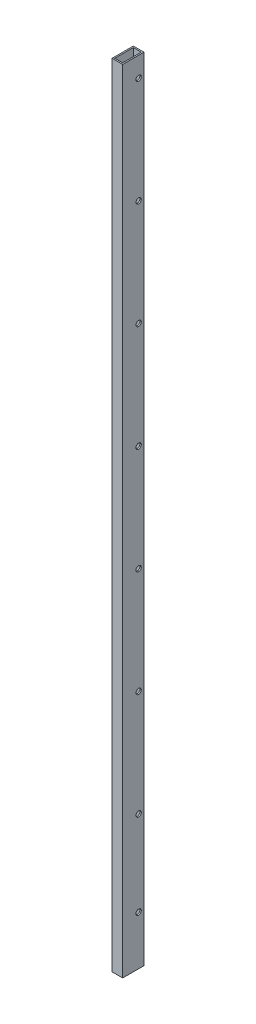
ISO-10303-21;
HEADER;
FILE_DESCRIPTION(('STEP AP214'),'2;1');
FILE_NAME('part.step','',(''),(''),'','','');
FILE_SCHEMA(('AUTOMOTIVE_DESIGN { 1 0 10303 214 1 1 1 1 }'));
ENDSEC;
DATA;
#1=APPLICATION_CONTEXT('core data for automotive mechanical design processes');
#2=APPLICATION_PROTOCOL_DEFINITION('international standard','automotive_design',2000,#1);
#3=PRODUCT_CONTEXT('',#1,'mechanical');
#4=PRODUCT('Part','Part','',(#3));
#5=PRODUCT_RELATED_PRODUCT_CATEGORY('part','',(#4));
#6=PRODUCT_DEFINITION_FORMATION('','',#4);
#7=PRODUCT_DEFINITION_CONTEXT('part definition',#1,'design');
#8=PRODUCT_DEFINITION('design','',#6,#7);
#9=PRODUCT_DEFINITION_SHAPE('','',#8);
#10=(LENGTH_UNIT() NAMED_UNIT(*) SI_UNIT(.MILLI.,.METRE.));
#11=(NAMED_UNIT(*) PLANE_ANGLE_UNIT() SI_UNIT($,.RADIAN.));
#12=(NAMED_UNIT(*) SI_UNIT($,.STERADIAN.) SOLID_ANGLE_UNIT());
#13=UNCERTAINTY_MEASURE_WITH_UNIT(LENGTH_MEASURE(1.E-05),#10,'distance_accuracy_value','');
#14=(GEOMETRIC_REPRESENTATION_CONTEXT(3) GLOBAL_UNCERTAINTY_ASSIGNED_CONTEXT((#13)) GLOBAL_UNIT_ASSIGNED_CONTEXT((#10,
#11,#12)) REPRESENTATION_CONTEXT('',''));
#15=CARTESIAN_POINT('',(0.,0.,0.));
#16=DIRECTION('',(0.,0.,1.));
#17=DIRECTION('',(1.,0.,0.));
#18=AXIS2_PLACEMENT_3D('',#15,#16,#17);
#19=CARTESIAN_POINT('',(0.,1892.3,0.));
#20=DIRECTION('',(0.,1.,0.));
#21=DIRECTION('',(0.,0.,1.));
#22=AXIS2_PLACEMENT_3D('',#19,#20,#21);
#23=PLANE('',#22);
#24=DIRECTION('',(0.,0.,-1.));
#25=VECTOR('',#24,1.);
#26=CARTESIAN_POINT('',(12.7,1892.3,-25.4));
#27=LINE('',#26,#25);
#28=CARTESIAN_POINT('',(12.7,1892.3,25.4));
#29=VERTEX_POINT('',#28);
#30=CARTESIAN_POINT('',(12.7,1892.3,-25.4));
#31=VERTEX_POINT('',#30);
#32=EDGE_CURVE('E138',#29,#31,#27,.T.);
#33=ORIENTED_EDGE('',*,*,#32,.T.);
#34=DIRECTION('',(-1.,0.,0.));
#35=VECTOR('',#34,1.);
#36=CARTESIAN_POINT('',(-12.7,1892.3,-25.4));
#37=LINE('',#36,#35);
#38=CARTESIAN_POINT('',(-12.7,1892.3,-25.4));
#39=VERTEX_POINT('',#38);
#40=EDGE_CURVE('E141',#31,#39,#37,.T.);
#41=ORIENTED_EDGE('',*,*,#40,.T.);
#42=DIRECTION('',(0.,0.,1.));
#43=VECTOR('',#42,1.);
#44=CARTESIAN_POINT('',(-12.7,1892.3,-25.4));
#45=LINE('',#44,#43);
#46=CARTESIAN_POINT('',(-12.7,1892.3,25.4));
#47=VERTEX_POINT('',#46);
#48=EDGE_CURVE('E144',#39,#47,#45,.T.);
#49=ORIENTED_EDGE('',*,*,#48,.T.);
#50=DIRECTION('',(1.,0.,0.));
#51=VECTOR('',#50,1.);
#52=CARTESIAN_POINT('',(-12.7,1892.3,25.4));
#53=LINE('',#52,#51);
#54=EDGE_CURVE('E146',#47,#29,#53,.T.);
#55=ORIENTED_EDGE('',*,*,#54,.T.);
#56=EDGE_LOOP('',(#33,#41,#49,#55));
#57=FACE_BOUND('',#56,.T.);
#58=DIRECTION('',(1.,0.,0.));
#59=VECTOR('',#58,1.);
#60=CARTESIAN_POINT('',(-9.525,1892.3,22.225));
#61=LINE('',#60,#59);
#62=CARTESIAN_POINT('',(-9.525,1892.3,22.225));
#63=VERTEX_POINT('',#62);
#64=CARTESIAN_POINT('',(9.525,1892.3,22.225));
#65=VERTEX_POINT('',#64);
#66=EDGE_CURVE('E108',#63,#65,#61,.T.);
#67=ORIENTED_EDGE('',*,*,#66,.F.);
#68=DIRECTION('',(0.,0.,1.));
#69=VECTOR('',#68,1.);
#70=CARTESIAN_POINT('',(-9.52500000000001,1892.3,-22.225));
#71=LINE('',#70,#69);
#72=CARTESIAN_POINT('',(-9.52500000000001,1892.3,-22.225));
#73=VERTEX_POINT('',#72);
#74=EDGE_CURVE('E100',#73,#63,#71,.T.);
#75=ORIENTED_EDGE('',*,*,#74,.F.);
#76=DIRECTION('',(-1.,0.,0.));
#77=VECTOR('',#76,1.);
#78=CARTESIAN_POINT('',(-9.52500000000001,1892.3,-22.225));
#79=LINE('',#78,#77);
#80=CARTESIAN_POINT('',(9.525,1892.3,-22.225));
#81=VERTEX_POINT('',#80);
#82=EDGE_CURVE('E122',#81,#73,#79,.T.);
#83=ORIENTED_EDGE('',*,*,#82,.F.);
#84=DIRECTION('',(0.,0.,-1.));
#85=VECTOR('',#84,1.);
#86=CARTESIAN_POINT('',(9.525,1892.3,-22.225));
#87=LINE('',#86,#85);
#88=EDGE_CURVE('E120',#65,#81,#87,.T.);
#89=ORIENTED_EDGE('',*,*,#88,.F.);
#90=EDGE_LOOP('',(#67,#75,#83,#89));
#91=FACE_BOUND('',#90,.T.);
#92=ADVANCED_FACE('F35',(#57,#91),#23,.T.);
#93=CARTESIAN_POINT('',(0.,0.,0.));
#94=DIRECTION('',(0.,1.,0.));
#95=DIRECTION('',(0.,0.,1.));
#96=AXIS2_PLACEMENT_3D('',#93,#94,#95);
#97=PLANE('',#96);
#98=DIRECTION('',(0.,0.,-1.));
#99=VECTOR('',#98,1.);
#100=CARTESIAN_POINT('',(12.7,0.,-25.4));
#101=LINE('',#100,#99);
#102=CARTESIAN_POINT('',(12.7,0.,25.4));
#103=VERTEX_POINT('',#102);
#104=CARTESIAN_POINT('',(12.7,0.,-25.4));
#105=VERTEX_POINT('',#104);
#106=EDGE_CURVE('E116',#103,#105,#101,.T.);
#107=ORIENTED_EDGE('',*,*,#106,.F.);
#108=DIRECTION('',(1.,0.,0.));
#109=VECTOR('',#108,1.);
#110=CARTESIAN_POINT('',(-12.7,0.,25.4));
#111=LINE('',#110,#109);
#112=CARTESIAN_POINT('',(-12.7,0.,25.4));
#113=VERTEX_POINT('',#112);
#114=EDGE_CURVE('E142',#113,#103,#111,.T.);
#115=ORIENTED_EDGE('',*,*,#114,.F.);
#116=DIRECTION('',(0.,0.,1.));
#117=VECTOR('',#116,1.);
#118=CARTESIAN_POINT('',(-12.7,0.,-25.4));
#119=LINE('',#118,#117);
#120=CARTESIAN_POINT('',(-12.7,0.,-25.4));
#121=VERTEX_POINT('',#120);
#122=EDGE_CURVE('E153',#121,#113,#119,.T.);
#123=ORIENTED_EDGE('',*,*,#122,.F.);
#124=DIRECTION('',(-1.,0.,0.));
#125=VECTOR('',#124,1.);
#126=CARTESIAN_POINT('',(-12.7,0.,-25.4));
#127=LINE('',#126,#125);
#128=EDGE_CURVE('E151',#105,#121,#127,.T.);
#129=ORIENTED_EDGE('',*,*,#128,.F.);
#130=EDGE_LOOP('',(#107,#115,#123,#129));
#131=FACE_BOUND('',#130,.T.);
#132=DIRECTION('',(0.,0.,1.));
#133=VECTOR('',#132,1.);
#134=CARTESIAN_POINT('',(-9.52500000000001,0.,-22.225));
#135=LINE('',#134,#133);
#136=CARTESIAN_POINT('',(-9.52500000000001,0.,-22.225));
#137=VERTEX_POINT('',#136);
#138=CARTESIAN_POINT('',(-9.525,0.,22.225));
#139=VERTEX_POINT('',#138);
#140=EDGE_CURVE('E58',#137,#139,#135,.T.);
#141=ORIENTED_EDGE('',*,*,#140,.T.);
#142=DIRECTION('',(1.,0.,0.));
#143=VECTOR('',#142,1.);
#144=CARTESIAN_POINT('',(-9.525,0.,22.225));
#145=LINE('',#144,#143);
#146=CARTESIAN_POINT('',(9.525,0.,22.225));
#147=VERTEX_POINT('',#146);
#148=EDGE_CURVE('E115',#139,#147,#145,.T.);
#149=ORIENTED_EDGE('',*,*,#148,.T.);
#150=DIRECTION('',(0.,0.,-1.));
#151=VECTOR('',#150,1.);
#152=CARTESIAN_POINT('',(9.525,0.,-22.225));
#153=LINE('',#152,#151);
#154=CARTESIAN_POINT('',(9.525,0.,-22.225));
#155=VERTEX_POINT('',#154);
#156=EDGE_CURVE('E130',#147,#155,#153,.T.);
#157=ORIENTED_EDGE('',*,*,#156,.T.);
#158=DIRECTION('',(-1.,0.,0.));
#159=VECTOR('',#158,1.);
#160=CARTESIAN_POINT('',(-9.52500000000001,0.,-22.225));
#161=LINE('',#160,#159);
#162=EDGE_CURVE('E109',#155,#137,#161,.T.);
#163=ORIENTED_EDGE('',*,*,#162,.T.);
#164=EDGE_LOOP('',(#141,#149,#157,#163));
#165=FACE_BOUND('',#164,.T.);
#166=ADVANCED_FACE('F171',(#131,#165),#97,.F.);
#167=CARTESIAN_POINT('',(12.7,1892.3,-25.4));
#168=DIRECTION('',(-1.,0.,0.));
#169=DIRECTION('',(0.,0.,1.));
#170=AXIS2_PLACEMENT_3D('',#167,#168,#169);
#171=PLANE('',#170);
#172=CARTESIAN_POINT('',(12.7,117.458598875323,-12.7000000000245));
#173=DIRECTION('',(1.,0.,0.));
#174=DIRECTION('',(0.,0.,-1.));
#175=AXIS2_PLACEMENT_3D('',#172,#173,#174);
#176=CIRCLE('',#175,6.35000000001205);
#177=CARTESIAN_POINT('',(12.7,117.458598875323,-19.0500000000365));
#178=VERTEX_POINT('',#177);
#179=EDGE_CURVE('E317',#178,#178,#176,.T.);
#180=ORIENTED_EDGE('',*,*,#179,.F.);
#181=EDGE_LOOP('',(#180));
#182=FACE_BOUND('',#181,.T.);
#183=CARTESIAN_POINT('',(12.7,320.658598875324,-12.6999999989671));
#184=DIRECTION('',(1.,0.,0.));
#185=DIRECTION('',(0.,0.,-1.));
#186=AXIS2_PLACEMENT_3D('',#183,#184,#185);
#187=CIRCLE('',#186,6.34999999999999);
#188=CARTESIAN_POINT('',(12.7,320.658598875324,-19.049999998967));
#189=VERTEX_POINT('',#188);
#190=EDGE_CURVE('E311',#189,#189,#187,.T.);
#191=ORIENTED_EDGE('',*,*,#190,.F.);
#192=EDGE_LOOP('',(#191));
#193=FACE_BOUND('',#192,.T.);
#194=CARTESIAN_POINT('',(12.7,574.658598875324,-12.6999999991433));
#195=DIRECTION('',(1.,0.,0.));
#196=DIRECTION('',(0.,0.,-1.));
#197=AXIS2_PLACEMENT_3D('',#194,#195,#196);
#198=CIRCLE('',#197,6.34999999999999);
#199=CARTESIAN_POINT('',(12.7,574.658598875324,-19.0499999991433));
#200=VERTEX_POINT('',#199);
#201=EDGE_CURVE('E305',#200,#200,#198,.T.);
#202=ORIENTED_EDGE('',*,*,#201,.F.);
#203=EDGE_LOOP('',(#202));
#204=FACE_BOUND('',#203,.T.);
#205=CARTESIAN_POINT('',(12.7,828.658598875324,-12.6999999993195));
#206=DIRECTION('',(1.,0.,0.));
#207=DIRECTION('',(0.,0.,-1.));
#208=AXIS2_PLACEMENT_3D('',#205,#206,#207);
#209=CIRCLE('',#208,6.34999999999998);
#210=CARTESIAN_POINT('',(12.7,828.658598875324,-19.0499999993195));
#211=VERTEX_POINT('',#210);
#212=EDGE_CURVE('E299',#211,#211,#209,.T.);
#213=ORIENTED_EDGE('',*,*,#212,.F.);
#214=EDGE_LOOP('',(#213));
#215=FACE_BOUND('',#214,.T.);
#216=CARTESIAN_POINT('',(12.7,1082.65859887532,-12.6999999994958));
#217=DIRECTION('',(1.,0.,0.));
#218=DIRECTION('',(0.,0.,-1.));
#219=AXIS2_PLACEMENT_3D('',#216,#217,#218);
#220=CIRCLE('',#219,6.34999999999999);
#221=CARTESIAN_POINT('',(12.7,1082.65859887532,-19.0499999994957));
#222=VERTEX_POINT('',#221);
#223=EDGE_CURVE('E293',#222,#222,#220,.T.);
#224=ORIENTED_EDGE('',*,*,#223,.F.);
#225=EDGE_LOOP('',(#224));
#226=FACE_BOUND('',#225,.T.);
#227=CARTESIAN_POINT('',(12.7,1336.65859887532,-12.699999999672));
#228=DIRECTION('',(1.,0.,0.));
#229=DIRECTION('',(0.,0.,-1.));
#230=AXIS2_PLACEMENT_3D('',#227,#228,#229);
#231=CIRCLE('',#230,6.34999999999999);
#232=CARTESIAN_POINT('',(12.7,1336.65859887532,-19.049999999672));
#233=VERTEX_POINT('',#232);
#234=EDGE_CURVE('E287',#233,#233,#231,.T.);
#235=ORIENTED_EDGE('',*,*,#234,.F.);
#236=EDGE_LOOP('',(#235));
#237=FACE_BOUND('',#236,.T.);
#238=CARTESIAN_POINT('',(12.7,1590.65859887532,-12.6999999998482));
#239=DIRECTION('',(1.,0.,0.));
#240=DIRECTION('',(0.,0.,-1.));
#241=AXIS2_PLACEMENT_3D('',#238,#239,#240);
#242=CIRCLE('',#241,6.34999999999998);
#243=CARTESIAN_POINT('',(12.7,1590.65859887532,-19.0499999998482));
#244=VERTEX_POINT('',#243);
#245=EDGE_CURVE('E281',#244,#244,#242,.T.);
#246=ORIENTED_EDGE('',*,*,#245,.F.);
#247=EDGE_LOOP('',(#246));
#248=FACE_BOUND('',#247,.T.);
#249=CARTESIAN_POINT('',(12.7,1844.65859887532,-12.7000000000245));
#250=DIRECTION('',(1.,0.,0.));
#251=DIRECTION('',(0.,0.,-1.));
#252=AXIS2_PLACEMENT_3D('',#249,#250,#251);
#253=CIRCLE('',#252,6.34999999999999);
#254=CARTESIAN_POINT('',(12.7,1844.65859887532,-19.0500000000245));
#255=VERTEX_POINT('',#254);
#256=EDGE_CURVE('E275',#255,#255,#253,.T.);
#257=ORIENTED_EDGE('',*,*,#256,.F.);
#258=EDGE_LOOP('',(#257));
#259=FACE_BOUND('',#258,.T.);
#260=ORIENTED_EDGE('',*,*,#106,.T.);
#261=DIRECTION('',(0.,-1.,0.));
#262=VECTOR('',#261,1.);
#263=CARTESIAN_POINT('',(12.7,1892.3,-25.4));
#264=LINE('',#263,#262);
#265=EDGE_CURVE('E11',#31,#105,#264,.T.);
#266=ORIENTED_EDGE('',*,*,#265,.F.);
#267=ORIENTED_EDGE('',*,*,#32,.F.);
#268=DIRECTION('',(0.,-1.,0.));
#269=VECTOR('',#268,1.);
#270=CARTESIAN_POINT('',(12.7,1892.3,25.4));
#271=LINE('',#270,#269);
#272=EDGE_CURVE('E148',#29,#103,#271,.T.);
#273=ORIENTED_EDGE('',*,*,#272,.T.);
#274=EDGE_LOOP('',(#260,#266,#267,#273));
#275=FACE_BOUND('',#274,.T.);
#276=ADVANCED_FACE('F37',(#182,#193,#204,#215,#226,#237,#248,#259,#275),#171,.F.);
#277=CARTESIAN_POINT('',(-12.7,1892.3,-25.4));
#278=DIRECTION('',(0.,0.,1.));
#279=DIRECTION('',(1.,0.,0.));
#280=AXIS2_PLACEMENT_3D('',#277,#278,#279);
#281=PLANE('',#280);
#282=ORIENTED_EDGE('',*,*,#128,.T.);
#283=DIRECTION('',(0.,-1.,0.));
#284=VECTOR('',#283,1.);
#285=CARTESIAN_POINT('',(-12.7,1892.3,-25.4));
#286=LINE('',#285,#284);
#287=EDGE_CURVE('E43',#39,#121,#286,.T.);
#288=ORIENTED_EDGE('',*,*,#287,.F.);
#289=ORIENTED_EDGE('',*,*,#40,.F.);
#290=ORIENTED_EDGE('',*,*,#265,.T.);
#291=EDGE_LOOP('',(#282,#288,#289,#290));
#292=FACE_BOUND('',#291,.T.);
#293=ADVANCED_FACE('F181',(#292),#281,.F.);
#294=CARTESIAN_POINT('',(-12.7,1892.3,-25.4));
#295=DIRECTION('',(1.,0.,0.));
#296=DIRECTION('',(0.,0.,-1.));
#297=AXIS2_PLACEMENT_3D('',#294,#295,#296);
#298=PLANE('',#297);
#299=CARTESIAN_POINT('',(-12.7,117.458598875323,-12.7000000000245));
#300=DIRECTION('',(1.,0.,0.));
#301=DIRECTION('',(0.,0.,-1.));
#302=AXIS2_PLACEMENT_3D('',#299,#300,#301);
#303=CIRCLE('',#302,3.17500000000928);
#304=CARTESIAN_POINT('',(-12.7,117.458598875323,-15.8750000000337));
#305=VERTEX_POINT('',#304);
#306=EDGE_CURVE('E271',#305,#305,#303,.T.);
#307=ORIENTED_EDGE('',*,*,#306,.T.);
#308=EDGE_LOOP('',(#307));
#309=FACE_BOUND('',#308,.T.);
#310=CARTESIAN_POINT('',(-12.7,320.658598875323,-12.7000000000405));
#311=DIRECTION('',(1.,0.,0.));
#312=DIRECTION('',(0.,0.,-1.));
#313=AXIS2_PLACEMENT_3D('',#310,#311,#312);
#314=CIRCLE('',#313,3.17499999999995);
#315=CARTESIAN_POINT('',(-12.7,320.658598875323,-15.8750000000404));
#316=VERTEX_POINT('',#315);
#317=EDGE_CURVE('E267',#316,#316,#314,.T.);
#318=ORIENTED_EDGE('',*,*,#317,.T.);
#319=EDGE_LOOP('',(#318));
#320=FACE_BOUND('',#319,.T.);
#321=CARTESIAN_POINT('',(-12.7,574.658598875323,-12.7000000000378));
#322=DIRECTION('',(1.,0.,0.));
#323=DIRECTION('',(0.,0.,-1.));
#324=AXIS2_PLACEMENT_3D('',#321,#322,#323);
#325=CIRCLE('',#324,3.17499999999996);
#326=CARTESIAN_POINT('',(-12.7,574.658598875323,-15.8750000000378));
#327=VERTEX_POINT('',#326);
#328=EDGE_CURVE('E263',#327,#327,#325,.T.);
#329=ORIENTED_EDGE('',*,*,#328,.T.);
#330=EDGE_LOOP('',(#329));
#331=FACE_BOUND('',#330,.T.);
#332=CARTESIAN_POINT('',(-12.7,828.658598875323,-12.7000000000351));
#333=DIRECTION('',(1.,0.,0.));
#334=DIRECTION('',(0.,0.,-1.));
#335=AXIS2_PLACEMENT_3D('',#332,#333,#334);
#336=CIRCLE('',#335,3.17499999999995);
#337=CARTESIAN_POINT('',(-12.7,828.658598875323,-15.8750000000351));
#338=VERTEX_POINT('',#337);
#339=EDGE_CURVE('E259',#338,#338,#336,.T.);
#340=ORIENTED_EDGE('',*,*,#339,.T.);
#341=EDGE_LOOP('',(#340));
#342=FACE_BOUND('',#341,.T.);
#343=CARTESIAN_POINT('',(-12.7,1082.65859887532,-12.7000000000325));
#344=DIRECTION('',(1.,0.,0.));
#345=DIRECTION('',(0.,0.,-1.));
#346=AXIS2_PLACEMENT_3D('',#343,#344,#345);
#347=CIRCLE('',#346,3.17499999999996);
#348=CARTESIAN_POINT('',(-12.7,1082.65859887532,-15.8750000000324));
#349=VERTEX_POINT('',#348);
#350=EDGE_CURVE('E255',#349,#349,#347,.T.);
#351=ORIENTED_EDGE('',*,*,#350,.T.);
#352=EDGE_LOOP('',(#351));
#353=FACE_BOUND('',#352,.T.);
#354=CARTESIAN_POINT('',(-12.7,1336.65859887532,-12.7000000000298));
#355=DIRECTION('',(1.,0.,0.));
#356=DIRECTION('',(0.,0.,-1.));
#357=AXIS2_PLACEMENT_3D('',#354,#355,#356);
#358=CIRCLE('',#357,3.17499999999996);
#359=CARTESIAN_POINT('',(-12.7,1336.65859887532,-15.8750000000298));
#360=VERTEX_POINT('',#359);
#361=EDGE_CURVE('E251',#360,#360,#358,.T.);
#362=ORIENTED_EDGE('',*,*,#361,.T.);
#363=EDGE_LOOP('',(#362));
#364=FACE_BOUND('',#363,.T.);
#365=CARTESIAN_POINT('',(-12.7,1590.65859887532,-12.7000000000272));
#366=DIRECTION('',(1.,0.,0.));
#367=DIRECTION('',(0.,0.,-1.));
#368=AXIS2_PLACEMENT_3D('',#365,#366,#367);
#369=CIRCLE('',#368,3.17499999999995);
#370=CARTESIAN_POINT('',(-12.7,1590.65859887532,-15.8750000000271));
#371=VERTEX_POINT('',#370);
#372=EDGE_CURVE('E247',#371,#371,#369,.T.);
#373=ORIENTED_EDGE('',*,*,#372,.T.);
#374=EDGE_LOOP('',(#373));
#375=FACE_BOUND('',#374,.T.);
#376=CARTESIAN_POINT('',(-12.7,1844.65859887532,-12.7000000000245));
#377=DIRECTION('',(1.,0.,0.));
#378=DIRECTION('',(0.,0.,-1.));
#379=AXIS2_PLACEMENT_3D('',#376,#377,#378);
#380=CIRCLE('',#379,3.17499999999996);
#381=CARTESIAN_POINT('',(-12.7,1844.65859887532,-15.8750000000245));
#382=VERTEX_POINT('',#381);
#383=EDGE_CURVE('E242',#382,#382,#380,.T.);
#384=ORIENTED_EDGE('',*,*,#383,.T.);
#385=EDGE_LOOP('',(#384));
#386=FACE_BOUND('',#385,.T.);
#387=ORIENTED_EDGE('',*,*,#122,.T.);
#388=DIRECTION('',(0.,-1.,0.));
#389=VECTOR('',#388,1.);
#390=CARTESIAN_POINT('',(-12.7,1892.3,25.4));
#391=LINE('',#390,#389);
#392=EDGE_CURVE('E158',#47,#113,#391,.T.);
#393=ORIENTED_EDGE('',*,*,#392,.F.);
#394=ORIENTED_EDGE('',*,*,#48,.F.);
#395=ORIENTED_EDGE('',*,*,#287,.T.);
#396=EDGE_LOOP('',(#387,#393,#394,#395));
#397=FACE_BOUND('',#396,.T.);
#398=ADVANCED_FACE('F165',(#309,#320,#331,#342,#353,#364,#375,#386,#397),#298,.F.);
#399=CARTESIAN_POINT('',(-12.7,1892.3,25.4));
#400=DIRECTION('',(0.,0.,-1.));
#401=DIRECTION('',(-1.,0.,0.));
#402=AXIS2_PLACEMENT_3D('',#399,#400,#401);
#403=PLANE('',#402);
#404=ORIENTED_EDGE('',*,*,#114,.T.);
#405=ORIENTED_EDGE('',*,*,#272,.F.);
#406=ORIENTED_EDGE('',*,*,#54,.F.);
#407=ORIENTED_EDGE('',*,*,#392,.T.);
#408=EDGE_LOOP('',(#404,#405,#406,#407));
#409=FACE_BOUND('',#408,.T.);
#410=ADVANCED_FACE('F175',(#409),#403,.F.);
#411=CARTESIAN_POINT('',(-9.52500000000001,1892.3,-22.225));
#412=DIRECTION('',(1.,0.,0.));
#413=DIRECTION('',(0.,0.,-1.));
#414=AXIS2_PLACEMENT_3D('',#411,#412,#413);
#415=PLANE('',#414);
#416=CARTESIAN_POINT('',(-9.525,117.458598875323,-12.7000000000245));
#417=DIRECTION('',(1.,0.,0.));
#418=DIRECTION('',(0.,0.,-1.));
#419=AXIS2_PLACEMENT_3D('',#416,#417,#418);
#420=CIRCLE('',#419,3.17500000000928);
#421=CARTESIAN_POINT('',(-9.525,117.458598875323,-15.8750000000337));
#422=VERTEX_POINT('',#421);
#423=EDGE_CURVE('E214',#422,#422,#420,.T.);
#424=ORIENTED_EDGE('',*,*,#423,.F.);
#425=EDGE_LOOP('',(#424));
#426=FACE_BOUND('',#425,.T.);
#427=CARTESIAN_POINT('',(-9.525,320.658598875323,-12.7000000000405));
#428=DIRECTION('',(1.,0.,0.));
#429=DIRECTION('',(0.,0.,-1.));
#430=AXIS2_PLACEMENT_3D('',#427,#428,#429);
#431=CIRCLE('',#430,3.17499999999995);
#432=CARTESIAN_POINT('',(-9.525,320.658598875323,-15.8750000000404));
#433=VERTEX_POINT('',#432);
#434=EDGE_CURVE('E218',#433,#433,#431,.T.);
#435=ORIENTED_EDGE('',*,*,#434,.F.);
#436=EDGE_LOOP('',(#435));
#437=FACE_BOUND('',#436,.T.);
#438=CARTESIAN_POINT('',(-9.525,574.658598875323,-12.7000000000378));
#439=DIRECTION('',(1.,0.,0.));
#440=DIRECTION('',(0.,0.,-1.));
#441=AXIS2_PLACEMENT_3D('',#438,#439,#440);
#442=CIRCLE('',#441,3.17499999999996);
#443=CARTESIAN_POINT('',(-9.525,574.658598875323,-15.8750000000378));
#444=VERTEX_POINT('',#443);
#445=EDGE_CURVE('E222',#444,#444,#442,.T.);
#446=ORIENTED_EDGE('',*,*,#445,.F.);
#447=EDGE_LOOP('',(#446));
#448=FACE_BOUND('',#447,.T.);
#449=CARTESIAN_POINT('',(-9.525,828.658598875323,-12.7000000000351));
#450=DIRECTION('',(1.,0.,0.));
#451=DIRECTION('',(0.,0.,-1.));
#452=AXIS2_PLACEMENT_3D('',#449,#450,#451);
#453=CIRCLE('',#452,3.17499999999995);
#454=CARTESIAN_POINT('',(-9.525,828.658598875323,-15.8750000000351));
#455=VERTEX_POINT('',#454);
#456=EDGE_CURVE('E226',#455,#455,#453,.T.);
#457=ORIENTED_EDGE('',*,*,#456,.F.);
#458=EDGE_LOOP('',(#457));
#459=FACE_BOUND('',#458,.T.);
#460=CARTESIAN_POINT('',(-9.525,1082.65859887532,-12.7000000000325));
#461=DIRECTION('',(1.,0.,0.));
#462=DIRECTION('',(0.,0.,-1.));
#463=AXIS2_PLACEMENT_3D('',#460,#461,#462);
#464=CIRCLE('',#463,3.17499999999996);
#465=CARTESIAN_POINT('',(-9.525,1082.65859887532,-15.8750000000324));
#466=VERTEX_POINT('',#465);
#467=EDGE_CURVE('E230',#466,#466,#464,.T.);
#468=ORIENTED_EDGE('',*,*,#467,.F.);
#469=EDGE_LOOP('',(#468));
#470=FACE_BOUND('',#469,.T.);
#471=CARTESIAN_POINT('',(-9.525,1336.65859887532,-12.7000000000298));
#472=DIRECTION('',(1.,0.,0.));
#473=DIRECTION('',(0.,0.,-1.));
#474=AXIS2_PLACEMENT_3D('',#471,#472,#473);
#475=CIRCLE('',#474,3.17499999999996);
#476=CARTESIAN_POINT('',(-9.525,1336.65859887532,-15.8750000000298));
#477=VERTEX_POINT('',#476);
#478=EDGE_CURVE('E234',#477,#477,#475,.T.);
#479=ORIENTED_EDGE('',*,*,#478,.F.);
#480=EDGE_LOOP('',(#479));
#481=FACE_BOUND('',#480,.T.);
#482=CARTESIAN_POINT('',(-9.525,1590.65859887532,-12.7000000000272));
#483=DIRECTION('',(1.,0.,0.));
#484=DIRECTION('',(0.,0.,-1.));
#485=AXIS2_PLACEMENT_3D('',#482,#483,#484);
#486=CIRCLE('',#485,3.17499999999995);
#487=CARTESIAN_POINT('',(-9.525,1590.65859887532,-15.8750000000271));
#488=VERTEX_POINT('',#487);
#489=EDGE_CURVE('E238',#488,#488,#486,.T.);
#490=ORIENTED_EDGE('',*,*,#489,.F.);
#491=EDGE_LOOP('',(#490));
#492=FACE_BOUND('',#491,.T.);
#493=CARTESIAN_POINT('',(-9.525,1844.65859887532,-12.7000000000245));
#494=DIRECTION('',(1.,0.,0.));
#495=DIRECTION('',(0.,0.,-1.));
#496=AXIS2_PLACEMENT_3D('',#493,#494,#495);
#497=CIRCLE('',#496,3.17499999999996);
#498=CARTESIAN_POINT('',(-9.525,1844.65859887532,-15.8750000000245));
#499=VERTEX_POINT('',#498);
#500=EDGE_CURVE('E128',#499,#499,#497,.T.);
#501=ORIENTED_EDGE('',*,*,#500,.F.);
#502=EDGE_LOOP('',(#501));
#503=FACE_BOUND('',#502,.T.);
#504=ORIENTED_EDGE('',*,*,#140,.F.);
#505=DIRECTION('',(0.,-1.,0.));
#506=VECTOR('',#505,1.);
#507=CARTESIAN_POINT('',(-9.52500000000001,1892.3,-22.225));
#508=LINE('',#507,#506);
#509=EDGE_CURVE('E104',#73,#137,#508,.T.);
#510=ORIENTED_EDGE('',*,*,#509,.F.);
#511=ORIENTED_EDGE('',*,*,#74,.T.);
#512=DIRECTION('',(0.,-1.,0.));
#513=VECTOR('',#512,1.);
#514=CARTESIAN_POINT('',(-9.525,1892.3,22.225));
#515=LINE('',#514,#513);
#516=EDGE_CURVE('E103',#63,#139,#515,.T.);
#517=ORIENTED_EDGE('',*,*,#516,.T.);
#518=EDGE_LOOP('',(#504,#510,#511,#517));
#519=FACE_BOUND('',#518,.T.);
#520=ADVANCED_FACE('F102',(#426,#437,#448,#459,#470,#481,#492,#503,#519),#415,.T.);
#521=CARTESIAN_POINT('',(-9.525,1892.3,22.225));
#522=DIRECTION('',(0.,0.,-1.));
#523=DIRECTION('',(-1.,0.,0.));
#524=AXIS2_PLACEMENT_3D('',#521,#522,#523);
#525=PLANE('',#524);
#526=ORIENTED_EDGE('',*,*,#148,.F.);
#527=ORIENTED_EDGE('',*,*,#516,.F.);
#528=ORIENTED_EDGE('',*,*,#66,.T.);
#529=DIRECTION('',(0.,-1.,0.));
#530=VECTOR('',#529,1.);
#531=CARTESIAN_POINT('',(9.525,1892.3,22.225));
#532=LINE('',#531,#530);
#533=EDGE_CURVE('E117',#65,#147,#532,.T.);
#534=ORIENTED_EDGE('',*,*,#533,.T.);
#535=EDGE_LOOP('',(#526,#527,#528,#534));
#536=FACE_BOUND('',#535,.T.);
#537=ADVANCED_FACE('F112',(#536),#525,.T.);
#538=CARTESIAN_POINT('',(9.525,1892.3,-22.225));
#539=DIRECTION('',(-1.,0.,0.));
#540=DIRECTION('',(0.,0.,1.));
#541=AXIS2_PLACEMENT_3D('',#538,#539,#540);
#542=PLANE('',#541);
#543=CARTESIAN_POINT('',(9.525,117.458598875323,-12.7000000000245));
#544=DIRECTION('',(1.,0.,0.));
#545=DIRECTION('',(0.,0.,-1.));
#546=AXIS2_PLACEMENT_3D('',#543,#544,#545);
#547=CIRCLE('',#546,6.35000000001205);
#548=CARTESIAN_POINT('',(9.52499999999999,117.458598875323,-19.0500000000365));
#549=VERTEX_POINT('',#548);
#550=EDGE_CURVE('E314',#549,#549,#547,.T.);
#551=ORIENTED_EDGE('',*,*,#550,.T.);
#552=EDGE_LOOP('',(#551));
#553=FACE_BOUND('',#552,.T.);
#554=CARTESIAN_POINT('',(9.525,320.658598875324,-12.6999999989671));
#555=DIRECTION('',(1.,0.,0.));
#556=DIRECTION('',(0.,0.,-1.));
#557=AXIS2_PLACEMENT_3D('',#554,#555,#556);
#558=CIRCLE('',#557,6.34999999999999);
#559=CARTESIAN_POINT('',(9.525,320.658598875324,-19.049999998967));
#560=VERTEX_POINT('',#559);
#561=EDGE_CURVE('E308',#560,#560,#558,.T.);
#562=ORIENTED_EDGE('',*,*,#561,.T.);
#563=EDGE_LOOP('',(#562));
#564=FACE_BOUND('',#563,.T.);
#565=CARTESIAN_POINT('',(9.525,574.658598875324,-12.6999999991433));
#566=DIRECTION('',(1.,0.,0.));
#567=DIRECTION('',(0.,0.,-1.));
#568=AXIS2_PLACEMENT_3D('',#565,#566,#567);
#569=CIRCLE('',#568,6.34999999999999);
#570=CARTESIAN_POINT('',(9.525,574.658598875324,-19.0499999991433));
#571=VERTEX_POINT('',#570);
#572=EDGE_CURVE('E302',#571,#571,#569,.T.);
#573=ORIENTED_EDGE('',*,*,#572,.T.);
#574=EDGE_LOOP('',(#573));
#575=FACE_BOUND('',#574,.T.);
#576=CARTESIAN_POINT('',(9.525,828.658598875324,-12.6999999993195));
#577=DIRECTION('',(1.,0.,0.));
#578=DIRECTION('',(0.,0.,-1.));
#579=AXIS2_PLACEMENT_3D('',#576,#577,#578);
#580=CIRCLE('',#579,6.34999999999998);
#581=CARTESIAN_POINT('',(9.525,828.658598875324,-19.0499999993195));
#582=VERTEX_POINT('',#581);
#583=EDGE_CURVE('E296',#582,#582,#580,.T.);
#584=ORIENTED_EDGE('',*,*,#583,.T.);
#585=EDGE_LOOP('',(#584));
#586=FACE_BOUND('',#585,.T.);
#587=CARTESIAN_POINT('',(9.525,1082.65859887532,-12.6999999994958));
#588=DIRECTION('',(1.,0.,0.));
#589=DIRECTION('',(0.,0.,-1.));
#590=AXIS2_PLACEMENT_3D('',#587,#588,#589);
#591=CIRCLE('',#590,6.34999999999999);
#592=CARTESIAN_POINT('',(9.525,1082.65859887532,-19.0499999994957));
#593=VERTEX_POINT('',#592);
#594=EDGE_CURVE('E290',#593,#593,#591,.T.);
#595=ORIENTED_EDGE('',*,*,#594,.T.);
#596=EDGE_LOOP('',(#595));
#597=FACE_BOUND('',#596,.T.);
#598=CARTESIAN_POINT('',(9.525,1336.65859887532,-12.699999999672));
#599=DIRECTION('',(1.,0.,0.));
#600=DIRECTION('',(0.,0.,-1.));
#601=AXIS2_PLACEMENT_3D('',#598,#599,#600);
#602=CIRCLE('',#601,6.34999999999999);
#603=CARTESIAN_POINT('',(9.525,1336.65859887532,-19.049999999672));
#604=VERTEX_POINT('',#603);
#605=EDGE_CURVE('E284',#604,#604,#602,.T.);
#606=ORIENTED_EDGE('',*,*,#605,.T.);
#607=EDGE_LOOP('',(#606));
#608=FACE_BOUND('',#607,.T.);
#609=CARTESIAN_POINT('',(9.525,1590.65859887532,-12.6999999998482));
#610=DIRECTION('',(1.,0.,0.));
#611=DIRECTION('',(0.,0.,-1.));
#612=AXIS2_PLACEMENT_3D('',#609,#610,#611);
#613=CIRCLE('',#612,6.34999999999998);
#614=CARTESIAN_POINT('',(9.525,1590.65859887532,-19.0499999998482));
#615=VERTEX_POINT('',#614);
#616=EDGE_CURVE('E278',#615,#615,#613,.T.);
#617=ORIENTED_EDGE('',*,*,#616,.T.);
#618=EDGE_LOOP('',(#617));
#619=FACE_BOUND('',#618,.T.);
#620=CARTESIAN_POINT('',(9.525,1844.65859887532,-12.7000000000245));
#621=DIRECTION('',(1.,0.,0.));
#622=DIRECTION('',(0.,0.,-1.));
#623=AXIS2_PLACEMENT_3D('',#620,#621,#622);
#624=CIRCLE('',#623,6.34999999999999);
#625=CARTESIAN_POINT('',(9.525,1844.65859887532,-19.0500000000245));
#626=VERTEX_POINT('',#625);
#627=EDGE_CURVE('E274',#626,#626,#624,.T.);
#628=ORIENTED_EDGE('',*,*,#627,.T.);
#629=EDGE_LOOP('',(#628));
#630=FACE_BOUND('',#629,.T.);
#631=ORIENTED_EDGE('',*,*,#156,.F.);
#632=ORIENTED_EDGE('',*,*,#533,.F.);
#633=ORIENTED_EDGE('',*,*,#88,.T.);
#634=DIRECTION('',(0.,-1.,0.));
#635=VECTOR('',#634,1.);
#636=CARTESIAN_POINT('',(9.525,1892.3,-22.225));
#637=LINE('',#636,#635);
#638=EDGE_CURVE('E50',#81,#155,#637,.T.);
#639=ORIENTED_EDGE('',*,*,#638,.T.);
#640=EDGE_LOOP('',(#631,#632,#633,#639));
#641=FACE_BOUND('',#640,.T.);
#642=ADVANCED_FACE('F210',(#553,#564,#575,#586,#597,#608,#619,#630,#641),#542,.T.);
#643=CARTESIAN_POINT('',(-9.52500000000001,1892.3,-22.225));
#644=DIRECTION('',(0.,0.,1.));
#645=DIRECTION('',(1.,0.,0.));
#646=AXIS2_PLACEMENT_3D('',#643,#644,#645);
#647=PLANE('',#646);
#648=ORIENTED_EDGE('',*,*,#162,.F.);
#649=ORIENTED_EDGE('',*,*,#638,.F.);
#650=ORIENTED_EDGE('',*,*,#82,.T.);
#651=ORIENTED_EDGE('',*,*,#509,.T.);
#652=EDGE_LOOP('',(#648,#649,#650,#651));
#653=FACE_BOUND('',#652,.T.);
#654=ADVANCED_FACE('F391',(#653),#647,.T.);
#655=CARTESIAN_POINT('',(-12.7,1844.65859887532,-12.7000000000245));
#656=DIRECTION('',(1.,0.,0.));
#657=DIRECTION('',(0.,0.,-1.));
#658=AXIS2_PLACEMENT_3D('',#655,#656,#657);
#659=CYLINDRICAL_SURFACE('',#658,3.17499999999996);
#660=ORIENTED_EDGE('',*,*,#500,.T.);
#661=EDGE_LOOP('',(#660));
#662=FACE_BOUND('',#661,.T.);
#663=ORIENTED_EDGE('',*,*,#383,.F.);
#664=EDGE_LOOP('',(#663));
#665=FACE_BOUND('',#664,.T.);
#666=ADVANCED_FACE('F387',(#662,#665),#659,.F.);
#667=CARTESIAN_POINT('',(-12.7,1590.65859887532,-12.7000000000272));
#668=DIRECTION('',(1.,0.,0.));
#669=DIRECTION('',(0.,0.,-1.));
#670=AXIS2_PLACEMENT_3D('',#667,#668,#669);
#671=CYLINDRICAL_SURFACE('',#670,3.17499999999995);
#672=ORIENTED_EDGE('',*,*,#489,.T.);
#673=EDGE_LOOP('',(#672));
#674=FACE_BOUND('',#673,.T.);
#675=ORIENTED_EDGE('',*,*,#372,.F.);
#676=EDGE_LOOP('',(#675));
#677=FACE_BOUND('',#676,.T.);
#678=ADVANCED_FACE('F383',(#674,#677),#671,.F.);
#679=CARTESIAN_POINT('',(-12.7,1336.65859887532,-12.7000000000298));
#680=DIRECTION('',(1.,0.,0.));
#681=DIRECTION('',(0.,0.,-1.));
#682=AXIS2_PLACEMENT_3D('',#679,#680,#681);
#683=CYLINDRICAL_SURFACE('',#682,3.17499999999996);
#684=ORIENTED_EDGE('',*,*,#478,.T.);
#685=EDGE_LOOP('',(#684));
#686=FACE_BOUND('',#685,.T.);
#687=ORIENTED_EDGE('',*,*,#361,.F.);
#688=EDGE_LOOP('',(#687));
#689=FACE_BOUND('',#688,.T.);
#690=ADVANCED_FACE('F379',(#686,#689),#683,.F.);
#691=CARTESIAN_POINT('',(-12.7,1082.65859887532,-12.7000000000325));
#692=DIRECTION('',(1.,0.,0.));
#693=DIRECTION('',(0.,0.,-1.));
#694=AXIS2_PLACEMENT_3D('',#691,#692,#693);
#695=CYLINDRICAL_SURFACE('',#694,3.17499999999996);
#696=ORIENTED_EDGE('',*,*,#467,.T.);
#697=EDGE_LOOP('',(#696));
#698=FACE_BOUND('',#697,.T.);
#699=ORIENTED_EDGE('',*,*,#350,.F.);
#700=EDGE_LOOP('',(#699));
#701=FACE_BOUND('',#700,.T.);
#702=ADVANCED_FACE('F375',(#698,#701),#695,.F.);
#703=CARTESIAN_POINT('',(-12.7,828.658598875323,-12.7000000000351));
#704=DIRECTION('',(1.,0.,0.));
#705=DIRECTION('',(0.,0.,-1.));
#706=AXIS2_PLACEMENT_3D('',#703,#704,#705);
#707=CYLINDRICAL_SURFACE('',#706,3.17499999999995);
#708=ORIENTED_EDGE('',*,*,#456,.T.);
#709=EDGE_LOOP('',(#708));
#710=FACE_BOUND('',#709,.T.);
#711=ORIENTED_EDGE('',*,*,#339,.F.);
#712=EDGE_LOOP('',(#711));
#713=FACE_BOUND('',#712,.T.);
#714=ADVANCED_FACE('F371',(#710,#713),#707,.F.);
#715=CARTESIAN_POINT('',(-12.7,574.658598875323,-12.7000000000378));
#716=DIRECTION('',(1.,0.,0.));
#717=DIRECTION('',(0.,0.,-1.));
#718=AXIS2_PLACEMENT_3D('',#715,#716,#717);
#719=CYLINDRICAL_SURFACE('',#718,3.17499999999996);
#720=ORIENTED_EDGE('',*,*,#445,.T.);
#721=EDGE_LOOP('',(#720));
#722=FACE_BOUND('',#721,.T.);
#723=ORIENTED_EDGE('',*,*,#328,.F.);
#724=EDGE_LOOP('',(#723));
#725=FACE_BOUND('',#724,.T.);
#726=ADVANCED_FACE('F367',(#722,#725),#719,.F.);
#727=CARTESIAN_POINT('',(-12.7,320.658598875323,-12.7000000000405));
#728=DIRECTION('',(1.,0.,0.));
#729=DIRECTION('',(0.,0.,-1.));
#730=AXIS2_PLACEMENT_3D('',#727,#728,#729);
#731=CYLINDRICAL_SURFACE('',#730,3.17499999999995);
#732=ORIENTED_EDGE('',*,*,#434,.T.);
#733=EDGE_LOOP('',(#732));
#734=FACE_BOUND('',#733,.T.);
#735=ORIENTED_EDGE('',*,*,#317,.F.);
#736=EDGE_LOOP('',(#735));
#737=FACE_BOUND('',#736,.T.);
#738=ADVANCED_FACE('F359',(#734,#737),#731,.F.);
#739=CARTESIAN_POINT('',(-12.7,117.458598875323,-12.7000000000245));
#740=DIRECTION('',(1.,0.,0.));
#741=DIRECTION('',(0.,0.,-1.));
#742=AXIS2_PLACEMENT_3D('',#739,#740,#741);
#743=CYLINDRICAL_SURFACE('',#742,3.17500000000928);
#744=ORIENTED_EDGE('',*,*,#423,.T.);
#745=EDGE_LOOP('',(#744));
#746=FACE_BOUND('',#745,.T.);
#747=ORIENTED_EDGE('',*,*,#306,.F.);
#748=EDGE_LOOP('',(#747));
#749=FACE_BOUND('',#748,.T.);
#750=ADVANCED_FACE('F349',(#746,#749),#743,.F.);
#751=CARTESIAN_POINT('',(9.525,1844.65859887532,-12.7000000000245));
#752=DIRECTION('',(1.,0.,0.));
#753=DIRECTION('',(0.,0.,-1.));
#754=AXIS2_PLACEMENT_3D('',#751,#752,#753);
#755=CYLINDRICAL_SURFACE('',#754,6.34999999999999);
#756=ORIENTED_EDGE('',*,*,#627,.F.);
#757=EDGE_LOOP('',(#756));
#758=FACE_BOUND('',#757,.T.);
#759=ORIENTED_EDGE('',*,*,#256,.T.);
#760=EDGE_LOOP('',(#759));
#761=FACE_BOUND('',#760,.T.);
#762=ADVANCED_FACE('F346',(#758,#761),#755,.F.);
#763=CARTESIAN_POINT('',(9.525,1590.65859887532,-12.6999999998482));
#764=DIRECTION('',(1.,0.,0.));
#765=DIRECTION('',(0.,0.,-1.));
#766=AXIS2_PLACEMENT_3D('',#763,#764,#765);
#767=CYLINDRICAL_SURFACE('',#766,6.34999999999998);
#768=ORIENTED_EDGE('',*,*,#616,.F.);
#769=EDGE_LOOP('',(#768));
#770=FACE_BOUND('',#769,.T.);
#771=ORIENTED_EDGE('',*,*,#245,.T.);
#772=EDGE_LOOP('',(#771));
#773=FACE_BOUND('',#772,.T.);
#774=ADVANCED_FACE('F348',(#770,#773),#767,.F.);
#775=CARTESIAN_POINT('',(9.525,1336.65859887532,-12.699999999672));
#776=DIRECTION('',(1.,0.,0.));
#777=DIRECTION('',(0.,0.,-1.));
#778=AXIS2_PLACEMENT_3D('',#775,#776,#777);
#779=CYLINDRICAL_SURFACE('',#778,6.34999999999999);
#780=ORIENTED_EDGE('',*,*,#605,.F.);
#781=EDGE_LOOP('',(#780));
#782=FACE_BOUND('',#781,.T.);
#783=ORIENTED_EDGE('',*,*,#234,.T.);
#784=EDGE_LOOP('',(#783));
#785=FACE_BOUND('',#784,.T.);
#786=ADVANCED_FACE('F356',(#782,#785),#779,.F.);
#787=CARTESIAN_POINT('',(9.525,1082.65859887532,-12.6999999994958));
#788=DIRECTION('',(1.,0.,0.));
#789=DIRECTION('',(0.,0.,-1.));
#790=AXIS2_PLACEMENT_3D('',#787,#788,#789);
#791=CYLINDRICAL_SURFACE('',#790,6.34999999999999);
#792=ORIENTED_EDGE('',*,*,#594,.F.);
#793=EDGE_LOOP('',(#792));
#794=FACE_BOUND('',#793,.T.);
#795=ORIENTED_EDGE('',*,*,#223,.T.);
#796=EDGE_LOOP('',(#795));
#797=FACE_BOUND('',#796,.T.);
#798=ADVANCED_FACE('F426',(#794,#797),#791,.F.);
#799=CARTESIAN_POINT('',(9.525,828.658598875324,-12.6999999993195));
#800=DIRECTION('',(1.,0.,0.));
#801=DIRECTION('',(0.,0.,-1.));
#802=AXIS2_PLACEMENT_3D('',#799,#800,#801);
#803=CYLINDRICAL_SURFACE('',#802,6.34999999999998);
#804=ORIENTED_EDGE('',*,*,#583,.F.);
#805=EDGE_LOOP('',(#804));
#806=FACE_BOUND('',#805,.T.);
#807=ORIENTED_EDGE('',*,*,#212,.T.);
#808=EDGE_LOOP('',(#807));
#809=FACE_BOUND('',#808,.T.);
#810=ADVANCED_FACE('F418',(#806,#809),#803,.F.);
#811=CARTESIAN_POINT('',(9.525,574.658598875324,-12.6999999991433));
#812=DIRECTION('',(1.,0.,0.));
#813=DIRECTION('',(0.,0.,-1.));
#814=AXIS2_PLACEMENT_3D('',#811,#812,#813);
#815=CYLINDRICAL_SURFACE('',#814,6.34999999999999);
#816=ORIENTED_EDGE('',*,*,#572,.F.);
#817=EDGE_LOOP('',(#816));
#818=FACE_BOUND('',#817,.T.);
#819=ORIENTED_EDGE('',*,*,#201,.T.);
#820=EDGE_LOOP('',(#819));
#821=FACE_BOUND('',#820,.T.);
#822=ADVANCED_FACE('F411',(#818,#821),#815,.F.);
#823=CARTESIAN_POINT('',(9.525,320.658598875324,-12.6999999989671));
#824=DIRECTION('',(1.,0.,0.));
#825=DIRECTION('',(0.,0.,-1.));
#826=AXIS2_PLACEMENT_3D('',#823,#824,#825);
#827=CYLINDRICAL_SURFACE('',#826,6.34999999999999);
#828=ORIENTED_EDGE('',*,*,#561,.F.);
#829=EDGE_LOOP('',(#828));
#830=FACE_BOUND('',#829,.T.);
#831=ORIENTED_EDGE('',*,*,#190,.T.);
#832=EDGE_LOOP('',(#831));
#833=FACE_BOUND('',#832,.T.);
#834=ADVANCED_FACE('F328',(#830,#833),#827,.F.);
#835=CARTESIAN_POINT('',(9.525,117.458598875323,-12.7000000000245));
#836=DIRECTION('',(1.,0.,0.));
#837=DIRECTION('',(0.,0.,-1.));
#838=AXIS2_PLACEMENT_3D('',#835,#836,#837);
#839=CYLINDRICAL_SURFACE('',#838,6.35000000001205);
#840=ORIENTED_EDGE('',*,*,#550,.F.);
#841=EDGE_LOOP('',(#840));
#842=FACE_BOUND('',#841,.T.);
#843=ORIENTED_EDGE('',*,*,#179,.T.);
#844=EDGE_LOOP('',(#843));
#845=FACE_BOUND('',#844,.T.);
#846=ADVANCED_FACE('F325',(#842,#845),#839,.F.);
#847=CLOSED_SHELL('',(#92,#166,#276,#293,#398,#410,#520,#537,#642,#654,#666,#678,#690,#702,#714,
#726,#738,#750,#762,#774,#786,#798,#810,#822,#834,#846));
#848=MANIFOLD_SOLID_BREP('B2',#847);
#849=ADVANCED_BREP_SHAPE_REPRESENTATION('',(#18,#848),#14);
#850=SHAPE_DEFINITION_REPRESENTATION(#9,#849);
ENDSEC;
END-ISO-10303-21;
